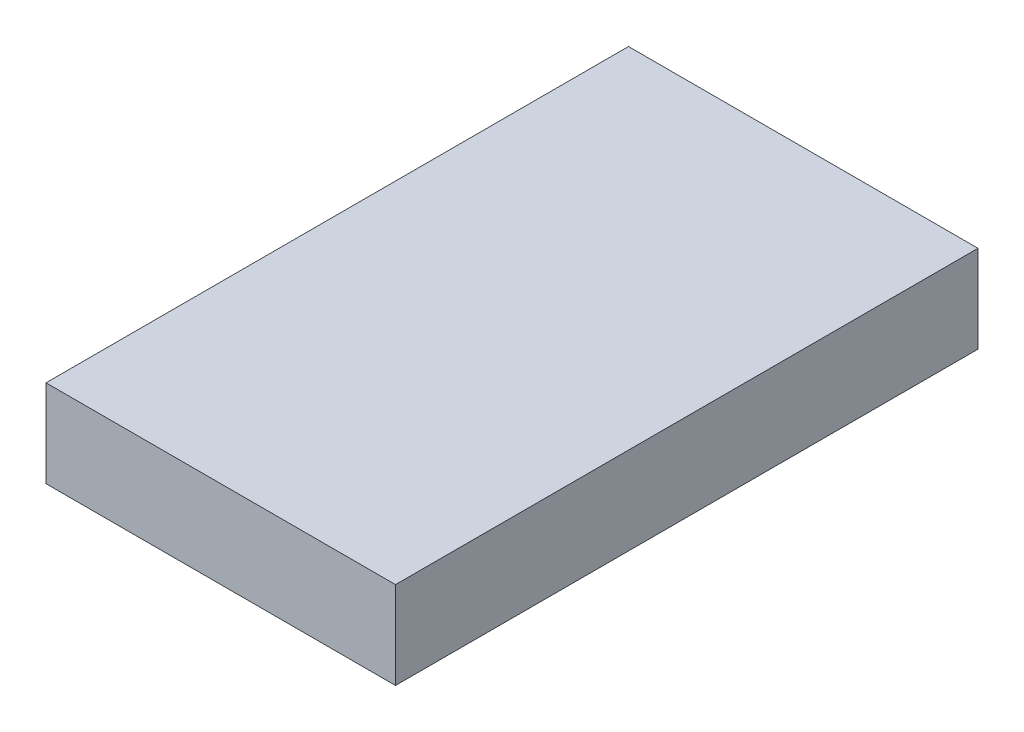
ISO-10303-21;
HEADER;
FILE_DESCRIPTION(('STEP AP214'),'2;1');
FILE_NAME('part.step','',(''),(''),'','','');
FILE_SCHEMA(('AUTOMOTIVE_DESIGN { 1 0 10303 214 1 1 1 1 }'));
ENDSEC;
DATA;
#1=APPLICATION_CONTEXT('core data for automotive mechanical design processes');
#2=APPLICATION_PROTOCOL_DEFINITION('international standard','automotive_design',2000,#1);
#3=PRODUCT_CONTEXT('',#1,'mechanical');
#4=PRODUCT('Part','Part','',(#3));
#5=PRODUCT_RELATED_PRODUCT_CATEGORY('part','',(#4));
#6=PRODUCT_DEFINITION_FORMATION('','',#4);
#7=PRODUCT_DEFINITION_CONTEXT('part definition',#1,'design');
#8=PRODUCT_DEFINITION('design','',#6,#7);
#9=PRODUCT_DEFINITION_SHAPE('','',#8);
#10=(LENGTH_UNIT() NAMED_UNIT(*) SI_UNIT(.MILLI.,.METRE.));
#11=(NAMED_UNIT(*) PLANE_ANGLE_UNIT() SI_UNIT($,.RADIAN.));
#12=(NAMED_UNIT(*) SI_UNIT($,.STERADIAN.) SOLID_ANGLE_UNIT());
#13=UNCERTAINTY_MEASURE_WITH_UNIT(LENGTH_MEASURE(1.E-05),#10,'distance_accuracy_value','');
#14=(GEOMETRIC_REPRESENTATION_CONTEXT(3) GLOBAL_UNCERTAINTY_ASSIGNED_CONTEXT((#13)) GLOBAL_UNIT_ASSIGNED_CONTEXT((#10,
#11,#12)) REPRESENTATION_CONTEXT('',''));
#15=CARTESIAN_POINT('',(0.,0.,0.));
#16=DIRECTION('',(0.,0.,1.));
#17=DIRECTION('',(1.,0.,0.));
#18=AXIS2_PLACEMENT_3D('',#15,#16,#17);
#19=CARTESIAN_POINT('',(-60.,1.38777878078145E-13,150.));
#20=DIRECTION('',(0.,0.,-1.));
#21=DIRECTION('',(0.,1.,0.));
#22=AXIS2_PLACEMENT_3D('',#19,#20,#21);
#23=PLANE('',#22);
#24=DIRECTION('',(1.,0.,0.));
#25=VECTOR('',#24,1.);
#26=CARTESIAN_POINT('',(-60.,30.,150.));
#27=LINE('',#26,#25);
#28=CARTESIAN_POINT('',(-60.,30.,150.));
#29=VERTEX_POINT('',#28);
#30=CARTESIAN_POINT('',(60.,30.,150.));
#31=VERTEX_POINT('',#30);
#32=EDGE_CURVE('E95',#29,#31,#27,.T.);
#33=ORIENTED_EDGE('',*,*,#32,.T.);
#34=DIRECTION('',(0.,1.,0.));
#35=VECTOR('',#34,1.);
#36=CARTESIAN_POINT('',(60.,1.38777878078145E-13,150.));
#37=LINE('',#36,#35);
#38=CARTESIAN_POINT('',(60.,0.,150.));
#39=VERTEX_POINT('',#38);
#40=EDGE_CURVE('E129',#39,#31,#37,.T.);
#41=ORIENTED_EDGE('',*,*,#40,.F.);
#42=DIRECTION('',(1.,0.,0.));
#43=VECTOR('',#42,1.);
#44=CARTESIAN_POINT('',(-60.,0.,150.));
#45=LINE('',#44,#43);
#46=CARTESIAN_POINT('',(-60.,0.,150.));
#47=VERTEX_POINT('',#46);
#48=EDGE_CURVE('E12',#47,#39,#45,.T.);
#49=ORIENTED_EDGE('',*,*,#48,.F.);
#50=DIRECTION('',(0.,1.,0.));
#51=VECTOR('',#50,1.);
#52=CARTESIAN_POINT('',(-60.,1.38777878078145E-13,150.));
#53=LINE('',#52,#51);
#54=EDGE_CURVE('E132',#47,#29,#53,.T.);
#55=ORIENTED_EDGE('',*,*,#54,.T.);
#56=EDGE_LOOP('',(#33,#41,#49,#55));
#57=FACE_BOUND('',#56,.T.);
#58=ADVANCED_FACE('F90',(#57),#23,.T.);
#59=CARTESIAN_POINT('',(-60.,0.,0.));
#60=DIRECTION('',(0.,1.,0.));
#61=DIRECTION('',(0.,0.,1.));
#62=AXIS2_PLACEMENT_3D('',#59,#60,#61);
#63=PLANE('',#62);
#64=ORIENTED_EDGE('',*,*,#48,.T.);
#65=DIRECTION('',(0.,0.,1.));
#66=VECTOR('',#65,1.);
#67=CARTESIAN_POINT('',(60.,0.,0.));
#68=LINE('',#67,#66);
#69=CARTESIAN_POINT('',(60.,0.,350.));
#70=VERTEX_POINT('',#69);
#71=EDGE_CURVE('E150',#39,#70,#68,.T.);
#72=ORIENTED_EDGE('',*,*,#71,.T.);
#73=DIRECTION('',(1.,0.,0.));
#74=VECTOR('',#73,1.);
#75=CARTESIAN_POINT('',(-60.,0.,350.));
#76=LINE('',#75,#74);
#77=CARTESIAN_POINT('',(-60.,0.,350.));
#78=VERTEX_POINT('',#77);
#79=EDGE_CURVE('E100',#78,#70,#76,.T.);
#80=ORIENTED_EDGE('',*,*,#79,.F.);
#81=DIRECTION('',(0.,0.,1.));
#82=VECTOR('',#81,1.);
#83=CARTESIAN_POINT('',(-60.,0.,0.));
#84=LINE('',#83,#82);
#85=EDGE_CURVE('E109',#47,#78,#84,.T.);
#86=ORIENTED_EDGE('',*,*,#85,.F.);
#87=EDGE_LOOP('',(#64,#72,#80,#86));
#88=FACE_BOUND('',#87,.T.);
#89=ADVANCED_FACE('F165',(#88),#63,.F.);
#90=CARTESIAN_POINT('',(-60.,0.,350.));
#91=DIRECTION('',(0.,0.,-1.));
#92=DIRECTION('',(-1.,0.,0.));
#93=AXIS2_PLACEMENT_3D('',#90,#91,#92);
#94=PLANE('',#93);
#95=ORIENTED_EDGE('',*,*,#79,.T.);
#96=DIRECTION('',(0.,1.,0.));
#97=VECTOR('',#96,1.);
#98=CARTESIAN_POINT('',(60.,0.,350.));
#99=LINE('',#98,#97);
#100=CARTESIAN_POINT('',(60.,30.,350.));
#101=VERTEX_POINT('',#100);
#102=EDGE_CURVE('E141',#70,#101,#99,.T.);
#103=ORIENTED_EDGE('',*,*,#102,.T.);
#104=DIRECTION('',(1.,0.,0.));
#105=VECTOR('',#104,1.);
#106=CARTESIAN_POINT('',(-60.,30.,350.));
#107=LINE('',#106,#105);
#108=CARTESIAN_POINT('',(-60.,30.,350.));
#109=VERTEX_POINT('',#108);
#110=EDGE_CURVE('E133',#109,#101,#107,.T.);
#111=ORIENTED_EDGE('',*,*,#110,.F.);
#112=DIRECTION('',(0.,1.,0.));
#113=VECTOR('',#112,1.);
#114=CARTESIAN_POINT('',(-60.,0.,350.));
#115=LINE('',#114,#113);
#116=EDGE_CURVE('E154',#78,#109,#115,.T.);
#117=ORIENTED_EDGE('',*,*,#116,.F.);
#118=EDGE_LOOP('',(#95,#103,#111,#117));
#119=FACE_BOUND('',#118,.T.);
#120=ADVANCED_FACE('F159',(#119),#94,.F.);
#121=CARTESIAN_POINT('',(-60.,30.,0.));
#122=DIRECTION('',(0.,1.,0.));
#123=DIRECTION('',(0.,0.,1.));
#124=AXIS2_PLACEMENT_3D('',#121,#122,#123);
#125=PLANE('',#124);
#126=ORIENTED_EDGE('',*,*,#110,.T.);
#127=DIRECTION('',(0.,0.,1.));
#128=VECTOR('',#127,1.);
#129=CARTESIAN_POINT('',(60.,30.,0.));
#130=LINE('',#129,#128);
#131=EDGE_CURVE('E140',#31,#101,#130,.T.);
#132=ORIENTED_EDGE('',*,*,#131,.F.);
#133=ORIENTED_EDGE('',*,*,#32,.F.);
#134=DIRECTION('',(0.,0.,1.));
#135=VECTOR('',#134,1.);
#136=CARTESIAN_POINT('',(-60.,30.,0.));
#137=LINE('',#136,#135);
#138=EDGE_CURVE('E153',#29,#109,#137,.T.);
#139=ORIENTED_EDGE('',*,*,#138,.T.);
#140=EDGE_LOOP('',(#126,#132,#133,#139));
#141=FACE_BOUND('',#140,.T.);
#142=ADVANCED_FACE('F138',(#141),#125,.T.);
#143=CARTESIAN_POINT('',(-60.,0.,0.));
#144=DIRECTION('',(1.,0.,0.));
#145=DIRECTION('',(0.,0.,-1.));
#146=AXIS2_PLACEMENT_3D('',#143,#144,#145);
#147=PLANE('',#146);
#148=ORIENTED_EDGE('',*,*,#54,.F.);
#149=ORIENTED_EDGE('',*,*,#85,.T.);
#150=ORIENTED_EDGE('',*,*,#116,.T.);
#151=ORIENTED_EDGE('',*,*,#138,.F.);
#152=EDGE_LOOP('',(#148,#149,#150,#151));
#153=FACE_BOUND('',#152,.T.);
#154=ADVANCED_FACE('F162',(#153),#147,.F.);
#155=CARTESIAN_POINT('',(60.,0.,0.));
#156=DIRECTION('',(1.,0.,0.));
#157=DIRECTION('',(0.,0.,-1.));
#158=AXIS2_PLACEMENT_3D('',#155,#156,#157);
#159=PLANE('',#158);
#160=ORIENTED_EDGE('',*,*,#40,.T.);
#161=ORIENTED_EDGE('',*,*,#131,.T.);
#162=ORIENTED_EDGE('',*,*,#102,.F.);
#163=ORIENTED_EDGE('',*,*,#71,.F.);
#164=EDGE_LOOP('',(#160,#161,#162,#163));
#165=FACE_BOUND('',#164,.T.);
#166=ADVANCED_FACE('F144',(#165),#159,.T.);
#167=CLOSED_SHELL('',(#58,#89,#120,#142,#154,#166));
#168=MANIFOLD_SOLID_BREP('B2',#167);
#169=ADVANCED_BREP_SHAPE_REPRESENTATION('',(#18,#168),#14);
#170=SHAPE_DEFINITION_REPRESENTATION(#9,#169);
ENDSEC;
END-ISO-10303-21;
